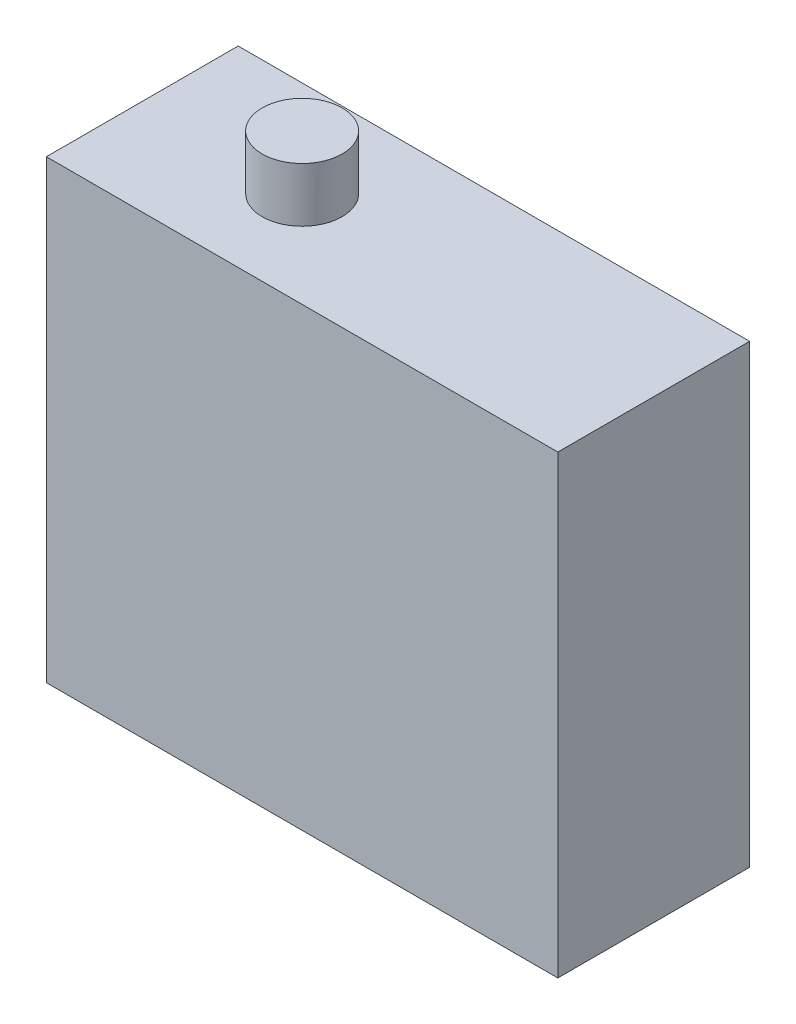
ISO-10303-21;
HEADER;
FILE_DESCRIPTION(('STEP AP214'),'2;1');
FILE_NAME('part.step','',(''),(''),'','','');
FILE_SCHEMA(('AUTOMOTIVE_DESIGN { 1 0 10303 214 1 1 1 1 }'));
ENDSEC;
DATA;
#1=APPLICATION_CONTEXT('core data for automotive mechanical design processes');
#2=APPLICATION_PROTOCOL_DEFINITION('international standard','automotive_design',2000,#1);
#3=PRODUCT_CONTEXT('',#1,'mechanical');
#4=PRODUCT('Part','Part','',(#3));
#5=PRODUCT_RELATED_PRODUCT_CATEGORY('part','',(#4));
#6=PRODUCT_DEFINITION_FORMATION('','',#4);
#7=PRODUCT_DEFINITION_CONTEXT('part definition',#1,'design');
#8=PRODUCT_DEFINITION('design','',#6,#7);
#9=PRODUCT_DEFINITION_SHAPE('','',#8);
#10=(LENGTH_UNIT() NAMED_UNIT(*) SI_UNIT(.MILLI.,.METRE.));
#11=(NAMED_UNIT(*) PLANE_ANGLE_UNIT() SI_UNIT($,.RADIAN.));
#12=(NAMED_UNIT(*) SI_UNIT($,.STERADIAN.) SOLID_ANGLE_UNIT());
#13=UNCERTAINTY_MEASURE_WITH_UNIT(LENGTH_MEASURE(1.E-05),#10,'distance_accuracy_value','');
#14=(GEOMETRIC_REPRESENTATION_CONTEXT(3) GLOBAL_UNCERTAINTY_ASSIGNED_CONTEXT((#13)) GLOBAL_UNIT_ASSIGNED_CONTEXT((#10,
#11,#12)) REPRESENTATION_CONTEXT('',''));
#15=CARTESIAN_POINT('',(0.,0.,0.));
#16=DIRECTION('',(0.,0.,1.));
#17=DIRECTION('',(1.,0.,0.));
#18=AXIS2_PLACEMENT_3D('',#15,#16,#17);
#19=CARTESIAN_POINT('',(0.,0.,12.));
#20=DIRECTION('',(1.,0.,0.));
#21=DIRECTION('',(0.,0.,-1.));
#22=AXIS2_PLACEMENT_3D('',#19,#20,#21);
#23=PLANE('',#22);
#24=DIRECTION('',(0.,-1.,0.));
#25=VECTOR('',#24,1.);
#26=CARTESIAN_POINT('',(0.,0.,0.));
#27=LINE('',#26,#25);
#28=CARTESIAN_POINT('',(0.,28.5,0.));
#29=VERTEX_POINT('',#28);
#30=CARTESIAN_POINT('',(0.,0.,0.));
#31=VERTEX_POINT('',#30);
#32=EDGE_CURVE('E101',#29,#31,#27,.T.);
#33=ORIENTED_EDGE('',*,*,#32,.T.);
#34=DIRECTION('',(0.,0.,-1.));
#35=VECTOR('',#34,1.);
#36=CARTESIAN_POINT('',(0.,0.,12.));
#37=LINE('',#36,#35);
#38=CARTESIAN_POINT('',(0.,0.,12.));
#39=VERTEX_POINT('',#38);
#40=EDGE_CURVE('E43',#39,#31,#37,.T.);
#41=ORIENTED_EDGE('',*,*,#40,.F.);
#42=DIRECTION('',(0.,-1.,0.));
#43=VECTOR('',#42,1.);
#44=CARTESIAN_POINT('',(0.,0.,12.));
#45=LINE('',#44,#43);
#46=CARTESIAN_POINT('',(0.,28.5,12.));
#47=VERTEX_POINT('',#46);
#48=EDGE_CURVE('E87',#47,#39,#45,.T.);
#49=ORIENTED_EDGE('',*,*,#48,.F.);
#50=DIRECTION('',(0.,0.,-1.));
#51=VECTOR('',#50,1.);
#52=CARTESIAN_POINT('',(0.,28.5,12.));
#53=LINE('',#52,#51);
#54=EDGE_CURVE('E97',#47,#29,#53,.T.);
#55=ORIENTED_EDGE('',*,*,#54,.T.);
#56=EDGE_LOOP('',(#33,#41,#49,#55));
#57=FACE_BOUND('',#56,.T.);
#58=ADVANCED_FACE('F35',(#57),#23,.F.);
#59=CARTESIAN_POINT('',(0.,0.,12.));
#60=DIRECTION('',(0.,1.,0.));
#61=DIRECTION('',(0.,0.,1.));
#62=AXIS2_PLACEMENT_3D('',#59,#60,#61);
#63=PLANE('',#62);
#64=DIRECTION('',(1.,0.,0.));
#65=VECTOR('',#64,1.);
#66=CARTESIAN_POINT('',(0.,0.,0.));
#67=LINE('',#66,#65);
#68=CARTESIAN_POINT('',(32.,0.,0.));
#69=VERTEX_POINT('',#68);
#70=EDGE_CURVE('E92',#31,#69,#67,.T.);
#71=ORIENTED_EDGE('',*,*,#70,.T.);
#72=DIRECTION('',(0.,0.,-1.));
#73=VECTOR('',#72,1.);
#74=CARTESIAN_POINT('',(32.,0.,12.));
#75=LINE('',#74,#73);
#76=CARTESIAN_POINT('',(32.,0.,12.));
#77=VERTEX_POINT('',#76);
#78=EDGE_CURVE('E90',#77,#69,#75,.T.);
#79=ORIENTED_EDGE('',*,*,#78,.F.);
#80=DIRECTION('',(1.,0.,0.));
#81=VECTOR('',#80,1.);
#82=CARTESIAN_POINT('',(0.,0.,12.));
#83=LINE('',#82,#81);
#84=EDGE_CURVE('E82',#39,#77,#83,.T.);
#85=ORIENTED_EDGE('',*,*,#84,.F.);
#86=ORIENTED_EDGE('',*,*,#40,.T.);
#87=EDGE_LOOP('',(#71,#79,#85,#86));
#88=FACE_BOUND('',#87,.T.);
#89=ADVANCED_FACE('F91',(#88),#63,.F.);
#90=CARTESIAN_POINT('',(32.,0.,12.));
#91=DIRECTION('',(-1.,0.,0.));
#92=DIRECTION('',(0.,0.,1.));
#93=AXIS2_PLACEMENT_3D('',#90,#91,#92);
#94=PLANE('',#93);
#95=DIRECTION('',(0.,1.,0.));
#96=VECTOR('',#95,1.);
#97=CARTESIAN_POINT('',(32.,0.,0.));
#98=LINE('',#97,#96);
#99=CARTESIAN_POINT('',(32.,28.5,0.));
#100=VERTEX_POINT('',#99);
#101=EDGE_CURVE('E68',#69,#100,#98,.T.);
#102=ORIENTED_EDGE('',*,*,#101,.T.);
#103=DIRECTION('',(0.,0.,-1.));
#104=VECTOR('',#103,1.);
#105=CARTESIAN_POINT('',(32.,28.5,12.));
#106=LINE('',#105,#104);
#107=CARTESIAN_POINT('',(32.,28.5,12.));
#108=VERTEX_POINT('',#107);
#109=EDGE_CURVE('E93',#108,#100,#106,.T.);
#110=ORIENTED_EDGE('',*,*,#109,.F.);
#111=DIRECTION('',(0.,1.,0.));
#112=VECTOR('',#111,1.);
#113=CARTESIAN_POINT('',(32.,0.,12.));
#114=LINE('',#113,#112);
#115=EDGE_CURVE('E85',#77,#108,#114,.T.);
#116=ORIENTED_EDGE('',*,*,#115,.F.);
#117=ORIENTED_EDGE('',*,*,#78,.T.);
#118=EDGE_LOOP('',(#102,#110,#116,#117));
#119=FACE_BOUND('',#118,.T.);
#120=ADVANCED_FACE('F95',(#119),#94,.F.);
#121=CARTESIAN_POINT('',(0.,28.5,12.));
#122=DIRECTION('',(0.,-1.,0.));
#123=DIRECTION('',(0.,0.,-1.));
#124=AXIS2_PLACEMENT_3D('',#121,#122,#123);
#125=PLANE('',#124);
#126=CARTESIAN_POINT('',(10.0032202686101,28.5,6.));
#127=DIRECTION('',(0.,-1.,0.));
#128=DIRECTION('',(0.,0.,-1.));
#129=AXIS2_PLACEMENT_3D('',#126,#127,#128);
#130=CIRCLE('',#129,2.5);
#131=CARTESIAN_POINT('',(10.0032202686101,28.5,3.5));
#132=VERTEX_POINT('',#131);
#133=EDGE_CURVE('E11',#132,#132,#130,.F.);
#134=ORIENTED_EDGE('',*,*,#133,.F.);
#135=EDGE_LOOP('',(#134));
#136=FACE_BOUND('',#135,.T.);
#137=DIRECTION('',(-1.,0.,0.));
#138=VECTOR('',#137,1.);
#139=CARTESIAN_POINT('',(0.,28.5,0.));
#140=LINE('',#139,#138);
#141=EDGE_CURVE('E74',#100,#29,#140,.T.);
#142=ORIENTED_EDGE('',*,*,#141,.T.);
#143=ORIENTED_EDGE('',*,*,#54,.F.);
#144=DIRECTION('',(-1.,0.,0.));
#145=VECTOR('',#144,1.);
#146=CARTESIAN_POINT('',(0.,28.5,12.));
#147=LINE('',#146,#145);
#148=EDGE_CURVE('E51',#108,#47,#147,.T.);
#149=ORIENTED_EDGE('',*,*,#148,.F.);
#150=ORIENTED_EDGE('',*,*,#109,.T.);
#151=EDGE_LOOP('',(#142,#143,#149,#150));
#152=FACE_BOUND('',#151,.T.);
#153=ADVANCED_FACE('F123',(#136,#152),#125,.F.);
#154=CARTESIAN_POINT('',(0.,0.,12.));
#155=DIRECTION('',(0.,0.,-1.));
#156=DIRECTION('',(-1.,0.,0.));
#157=AXIS2_PLACEMENT_3D('',#154,#155,#156);
#158=PLANE('',#157);
#159=ORIENTED_EDGE('',*,*,#48,.T.);
#160=ORIENTED_EDGE('',*,*,#84,.T.);
#161=ORIENTED_EDGE('',*,*,#115,.T.);
#162=ORIENTED_EDGE('',*,*,#148,.T.);
#163=EDGE_LOOP('',(#159,#160,#161,#162));
#164=FACE_BOUND('',#163,.T.);
#165=ADVANCED_FACE('F83',(#164),#158,.F.);
#166=CARTESIAN_POINT('',(0.,0.,0.));
#167=DIRECTION('',(0.,0.,-1.));
#168=DIRECTION('',(-1.,0.,0.));
#169=AXIS2_PLACEMENT_3D('',#166,#167,#168);
#170=PLANE('',#169);
#171=ORIENTED_EDGE('',*,*,#32,.F.);
#172=ORIENTED_EDGE('',*,*,#141,.F.);
#173=ORIENTED_EDGE('',*,*,#101,.F.);
#174=ORIENTED_EDGE('',*,*,#70,.F.);
#175=EDGE_LOOP('',(#171,#172,#173,#174));
#176=FACE_BOUND('',#175,.T.);
#177=ADVANCED_FACE('F112',(#176),#170,.T.);
#178=CARTESIAN_POINT('',(10.0032202686101,31.9,6.));
#179=DIRECTION('',(0.,-1.,0.));
#180=DIRECTION('',(0.,0.,-1.));
#181=AXIS2_PLACEMENT_3D('',#178,#179,#180);
#182=CYLINDRICAL_SURFACE('',#181,2.5);
#183=CARTESIAN_POINT('',(10.0032202686101,31.9,6.));
#184=DIRECTION('',(0.,1.,0.));
#185=DIRECTION('',(0.,0.,1.));
#186=AXIS2_PLACEMENT_3D('',#183,#184,#185);
#187=CIRCLE('',#186,2.5);
#188=CARTESIAN_POINT('',(10.0032202686101,31.9,8.5));
#189=VERTEX_POINT('',#188);
#190=EDGE_CURVE('E104',#189,#189,#187,.T.);
#191=ORIENTED_EDGE('',*,*,#190,.F.);
#192=EDGE_LOOP('',(#191));
#193=FACE_BOUND('',#192,.T.);
#194=ORIENTED_EDGE('',*,*,#133,.T.);
#195=EDGE_LOOP('',(#194));
#196=FACE_BOUND('',#195,.T.);
#197=ADVANCED_FACE('F114',(#193,#196),#182,.T.);
#198=CARTESIAN_POINT('',(10.0032202686101,31.9,6.));
#199=DIRECTION('',(0.,1.,0.));
#200=DIRECTION('',(0.,0.,1.));
#201=AXIS2_PLACEMENT_3D('',#198,#199,#200);
#202=PLANE('',#201);
#203=ORIENTED_EDGE('',*,*,#190,.T.);
#204=EDGE_LOOP('',(#203));
#205=FACE_BOUND('',#204,.T.);
#206=ADVANCED_FACE('F120',(#205),#202,.T.);
#207=CLOSED_SHELL('',(#58,#89,#120,#153,#165,#177,#197,#206));
#208=MANIFOLD_SOLID_BREP('B2',#207);
#209=ADVANCED_BREP_SHAPE_REPRESENTATION('',(#18,#208),#14);
#210=SHAPE_DEFINITION_REPRESENTATION(#9,#209);
ENDSEC;
END-ISO-10303-21;
